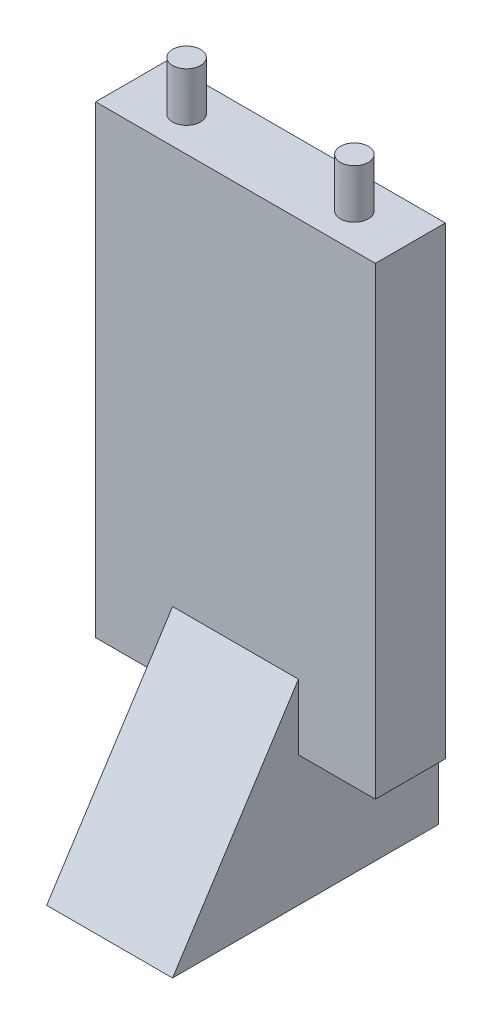
ISO-10303-21;
HEADER;
FILE_DESCRIPTION(('STEP AP214'),'2;1');
FILE_NAME('part.step','',(''),(''),'','','');
FILE_SCHEMA(('AUTOMOTIVE_DESIGN { 1 0 10303 214 1 1 1 1 }'));
ENDSEC;
DATA;
#1=APPLICATION_CONTEXT('core data for automotive mechanical design processes');
#2=APPLICATION_PROTOCOL_DEFINITION('international standard','automotive_design',2000,#1);
#3=PRODUCT_CONTEXT('',#1,'mechanical');
#4=PRODUCT('Part','Part','',(#3));
#5=PRODUCT_RELATED_PRODUCT_CATEGORY('part','',(#4));
#6=PRODUCT_DEFINITION_FORMATION('','',#4);
#7=PRODUCT_DEFINITION_CONTEXT('part definition',#1,'design');
#8=PRODUCT_DEFINITION('design','',#6,#7);
#9=PRODUCT_DEFINITION_SHAPE('','',#8);
#10=(LENGTH_UNIT() NAMED_UNIT(*) SI_UNIT(.MILLI.,.METRE.));
#11=(NAMED_UNIT(*) PLANE_ANGLE_UNIT() SI_UNIT($,.RADIAN.));
#12=(NAMED_UNIT(*) SI_UNIT($,.STERADIAN.) SOLID_ANGLE_UNIT());
#13=UNCERTAINTY_MEASURE_WITH_UNIT(LENGTH_MEASURE(1.E-05),#10,'distance_accuracy_value','');
#14=(GEOMETRIC_REPRESENTATION_CONTEXT(3) GLOBAL_UNCERTAINTY_ASSIGNED_CONTEXT((#13)) GLOBAL_UNIT_ASSIGNED_CONTEXT((#10,
#11,#12)) REPRESENTATION_CONTEXT('',''));
#15=CARTESIAN_POINT('',(0.,0.,0.));
#16=DIRECTION('',(0.,0.,1.));
#17=DIRECTION('',(1.,0.,0.));
#18=AXIS2_PLACEMENT_3D('',#15,#16,#17);
#19=CARTESIAN_POINT('',(-21.3420120940224,215.9,10.6710060470112));
#20=DIRECTION('',(0.,0.,-1.));
#21=DIRECTION('',(-1.,0.,0.));
#22=AXIS2_PLACEMENT_3D('',#19,#20,#21);
#23=PLANE('',#22);
#24=DIRECTION('',(0.,-1.,0.));
#25=VECTOR('',#24,1.);
#26=CARTESIAN_POINT('',(6.59798790597757,0.,10.6710060470112));
#27=LINE('',#26,#25);
#28=CARTESIAN_POINT('',(6.59798790597756,71.12,10.6710060470112));
#29=VERTEX_POINT('',#28);
#30=CARTESIAN_POINT('',(6.59798790597757,47.3460802250252,10.6710060470112));
#31=VERTEX_POINT('',#30);
#32=EDGE_CURVE('E186',#29,#31,#27,.T.);
#33=ORIENTED_EDGE('',*,*,#32,.F.);
#34=DIRECTION('',(-1.,0.,0.));
#35=VECTOR('',#34,1.);
#36=CARTESIAN_POINT('',(6.59798790597757,71.12,10.6710060470112));
#37=LINE('',#36,#35);
#38=CARTESIAN_POINT('',(52.3179879059776,71.12,10.6710060470112));
#39=VERTEX_POINT('',#38);
#40=EDGE_CURVE('E193',#39,#29,#37,.T.);
#41=ORIENTED_EDGE('',*,*,#40,.F.);
#42=DIRECTION('',(0.,1.,0.));
#43=VECTOR('',#42,1.);
#44=CARTESIAN_POINT('',(52.3179879059776,0.,10.6710060470112));
#45=LINE('',#44,#43);
#46=CARTESIAN_POINT('',(52.3179879059776,47.3460802250251,10.6710060470112));
#47=VERTEX_POINT('',#46);
#48=EDGE_CURVE('E56',#47,#39,#45,.T.);
#49=ORIENTED_EDGE('',*,*,#48,.F.);
#50=DIRECTION('',(-1.,0.,0.));
#51=VECTOR('',#50,1.);
#52=CARTESIAN_POINT('',(80.2579879059776,47.3460802250252,10.6710060470112));
#53=LINE('',#52,#51);
#54=CARTESIAN_POINT('',(80.2579879059776,47.3460802250252,10.6710060470112));
#55=VERTEX_POINT('',#54);
#56=EDGE_CURVE('E205',#55,#47,#53,.T.);
#57=ORIENTED_EDGE('',*,*,#56,.F.);
#58=DIRECTION('',(0.,-1.,0.));
#59=VECTOR('',#58,1.);
#60=CARTESIAN_POINT('',(80.2579879059776,215.9,10.6710060470112));
#61=LINE('',#60,#59);
#62=CARTESIAN_POINT('',(80.2579879059776,215.9,10.6710060470112));
#63=VERTEX_POINT('',#62);
#64=EDGE_CURVE('E245',#63,#55,#61,.T.);
#65=ORIENTED_EDGE('',*,*,#64,.F.);
#66=DIRECTION('',(1.,0.,0.));
#67=VECTOR('',#66,1.);
#68=CARTESIAN_POINT('',(-21.3420120940224,215.9,10.6710060470112));
#69=LINE('',#68,#67);
#70=CARTESIAN_POINT('',(-21.3420120940224,215.9,10.6710060470112));
#71=VERTEX_POINT('',#70);
#72=EDGE_CURVE('E238',#71,#63,#69,.T.);
#73=ORIENTED_EDGE('',*,*,#72,.F.);
#74=DIRECTION('',(0.,-1.,0.));
#75=VECTOR('',#74,1.);
#76=CARTESIAN_POINT('',(-21.3420120940224,215.9,10.6710060470112));
#77=LINE('',#76,#75);
#78=CARTESIAN_POINT('',(-21.3420120940224,47.3460802250252,10.6710060470112));
#79=VERTEX_POINT('',#78);
#80=EDGE_CURVE('E72',#71,#79,#77,.T.);
#81=ORIENTED_EDGE('',*,*,#80,.T.);
#82=DIRECTION('',(-1.,0.,0.));
#83=VECTOR('',#82,1.);
#84=CARTESIAN_POINT('',(-21.3420120940224,47.3460802250252,10.6710060470112));
#85=LINE('',#84,#83);
#86=EDGE_CURVE('E201',#31,#79,#85,.T.);
#87=ORIENTED_EDGE('',*,*,#86,.F.);
#88=EDGE_LOOP('',(#33,#41,#49,#57,#65,#73,#81,#87));
#89=FACE_BOUND('',#88,.T.);
#90=ADVANCED_FACE('F46',(#89),#23,.F.);
#91=CARTESIAN_POINT('',(-21.3420120940224,215.9,10.6710060470112));
#92=DIRECTION('',(-1.,0.,0.));
#93=DIRECTION('',(0.,0.,1.));
#94=AXIS2_PLACEMENT_3D('',#91,#92,#93);
#95=PLANE('',#94);
#96=DIRECTION('',(0.,0.,1.));
#97=VECTOR('',#96,1.);
#98=CARTESIAN_POINT('',(-21.3420120940224,47.3460802250252,-17.0149939529888));
#99=LINE('',#98,#97);
#100=CARTESIAN_POINT('',(-21.3420120940224,47.3460802250252,-14.7289939529888));
#101=VERTEX_POINT('',#100);
#102=EDGE_CURVE('E206',#101,#79,#99,.T.);
#103=ORIENTED_EDGE('',*,*,#102,.T.);
#104=ORIENTED_EDGE('',*,*,#80,.F.);
#105=DIRECTION('',(0.,0.,-1.));
#106=VECTOR('',#105,1.);
#107=CARTESIAN_POINT('',(-21.3420120940224,215.9,10.6710060470112));
#108=LINE('',#107,#106);
#109=CARTESIAN_POINT('',(-21.3420120940224,215.9,-14.7289939529888));
#110=VERTEX_POINT('',#109);
#111=EDGE_CURVE('E225',#71,#110,#108,.T.);
#112=ORIENTED_EDGE('',*,*,#111,.T.);
#113=DIRECTION('',(0.,-1.,0.));
#114=VECTOR('',#113,1.);
#115=CARTESIAN_POINT('',(-21.3420120940224,215.9,-14.7289939529888));
#116=LINE('',#115,#114);
#117=EDGE_CURVE('E241',#110,#101,#116,.T.);
#118=ORIENTED_EDGE('',*,*,#117,.T.);
#119=EDGE_LOOP('',(#103,#104,#112,#118));
#120=FACE_BOUND('',#119,.T.);
#121=ADVANCED_FACE('F48',(#120),#95,.T.);
#122=CARTESIAN_POINT('',(80.2579879059776,215.9,10.6710060470112));
#123=DIRECTION('',(-1.,0.,0.));
#124=DIRECTION('',(0.,0.,1.));
#125=AXIS2_PLACEMENT_3D('',#122,#123,#124);
#126=PLANE('',#125);
#127=ORIENTED_EDGE('',*,*,#64,.T.);
#128=DIRECTION('',(0.,0.,1.));
#129=VECTOR('',#128,1.);
#130=CARTESIAN_POINT('',(80.2579879059776,47.3460802250252,-17.0149939529888));
#131=LINE('',#130,#129);
#132=CARTESIAN_POINT('',(80.2579879059776,47.3460802250252,-14.7289939529888));
#133=VERTEX_POINT('',#132);
#134=EDGE_CURVE('E212',#133,#55,#131,.T.);
#135=ORIENTED_EDGE('',*,*,#134,.F.);
#136=DIRECTION('',(0.,-1.,0.));
#137=VECTOR('',#136,1.);
#138=CARTESIAN_POINT('',(80.2579879059776,215.9,-14.7289939529888));
#139=LINE('',#138,#137);
#140=CARTESIAN_POINT('',(80.2579879059776,215.9,-14.7289939529888));
#141=VERTEX_POINT('',#140);
#142=EDGE_CURVE('E249',#141,#133,#139,.T.);
#143=ORIENTED_EDGE('',*,*,#142,.F.);
#144=DIRECTION('',(0.,0.,-1.));
#145=VECTOR('',#144,1.);
#146=CARTESIAN_POINT('',(80.2579879059776,215.9,10.6710060470112));
#147=LINE('',#146,#145);
#148=EDGE_CURVE('E235',#63,#141,#147,.T.);
#149=ORIENTED_EDGE('',*,*,#148,.F.);
#150=EDGE_LOOP('',(#127,#135,#143,#149));
#151=FACE_BOUND('',#150,.T.);
#152=ADVANCED_FACE('F289',(#151),#126,.F.);
#153=CARTESIAN_POINT('',(-21.3420120940224,215.9,-14.7289939529888));
#154=DIRECTION('',(0.,0.,-1.));
#155=DIRECTION('',(-1.,0.,0.));
#156=AXIS2_PLACEMENT_3D('',#153,#154,#155);
#157=PLANE('',#156);
#158=DIRECTION('',(0.,-1.,0.));
#159=VECTOR('',#158,1.);
#160=CARTESIAN_POINT('',(52.3179879059776,47.3460802250251,-14.7289939529888));
#161=LINE('',#160,#159);
#162=CARTESIAN_POINT('',(52.3179879059776,70.9793744220683,-14.7289939529888));
#163=VERTEX_POINT('',#162);
#164=CARTESIAN_POINT('',(52.3179879059776,47.3460802250251,-14.7289939529888));
#165=VERTEX_POINT('',#164);
#166=EDGE_CURVE('E64',#163,#165,#161,.T.);
#167=ORIENTED_EDGE('',*,*,#166,.F.);
#168=DIRECTION('',(1.,0.,0.));
#169=VECTOR('',#168,1.);
#170=CARTESIAN_POINT('',(6.59798790597757,70.9793744220683,-14.7289939529888));
#171=LINE('',#170,#169);
#172=CARTESIAN_POINT('',(6.59798790597757,70.9793744220683,-14.7289939529888));
#173=VERTEX_POINT('',#172);
#174=EDGE_CURVE('E166',#173,#163,#171,.T.);
#175=ORIENTED_EDGE('',*,*,#174,.F.);
#176=DIRECTION('',(0.,1.,0.));
#177=VECTOR('',#176,1.);
#178=CARTESIAN_POINT('',(6.59798790597757,47.3460802250252,-14.7289939529888));
#179=LINE('',#178,#177);
#180=CARTESIAN_POINT('',(6.59798790597757,47.3460802250252,-14.7289939529888));
#181=VERTEX_POINT('',#180);
#182=EDGE_CURVE('E12',#181,#173,#179,.T.);
#183=ORIENTED_EDGE('',*,*,#182,.F.);
#184=DIRECTION('',(1.,0.,0.));
#185=VECTOR('',#184,1.);
#186=CARTESIAN_POINT('',(-21.3420120940224,47.3460802250251,-14.7289939529888));
#187=LINE('',#186,#185);
#188=EDGE_CURVE('E50',#101,#181,#187,.T.);
#189=ORIENTED_EDGE('',*,*,#188,.F.);
#190=ORIENTED_EDGE('',*,*,#117,.F.);
#191=DIRECTION('',(1.,0.,0.));
#192=VECTOR('',#191,1.);
#193=CARTESIAN_POINT('',(-21.3420120940224,215.9,-14.7289939529888));
#194=LINE('',#193,#192);
#195=EDGE_CURVE('E231',#110,#141,#194,.T.);
#196=ORIENTED_EDGE('',*,*,#195,.T.);
#197=ORIENTED_EDGE('',*,*,#142,.T.);
#198=DIRECTION('',(1.,0.,0.));
#199=VECTOR('',#198,1.);
#200=CARTESIAN_POINT('',(-21.3420120940224,47.3460802250251,-14.7289939529888));
#201=LINE('',#200,#199);
#202=EDGE_CURVE('E263',#165,#133,#201,.T.);
#203=ORIENTED_EDGE('',*,*,#202,.F.);
#204=EDGE_LOOP('',(#167,#175,#183,#189,#190,#196,#197,#203));
#205=FACE_BOUND('',#204,.T.);
#206=ADVANCED_FACE('F282',(#205),#157,.T.);
#207=CARTESIAN_POINT('',(0.,215.9,0.));
#208=DIRECTION('',(0.,-1.,0.));
#209=DIRECTION('',(0.,0.,-1.));
#210=AXIS2_PLACEMENT_3D('',#207,#208,#209);
#211=PLANE('',#210);
#212=CARTESIAN_POINT('',(59.9379879059776,215.9,-2.02899395298878));
#213=DIRECTION('',(0.,-1.,0.));
#214=DIRECTION('',(0.,0.,-1.));
#215=AXIS2_PLACEMENT_3D('',#212,#213,#214);
#216=CIRCLE('',#215,5.08);
#217=CARTESIAN_POINT('',(59.9379879059776,215.9,-7.10899395298879));
#218=VERTEX_POINT('',#217);
#219=EDGE_CURVE('E148',#218,#218,#216,.F.);
#220=ORIENTED_EDGE('',*,*,#219,.F.);
#221=EDGE_LOOP('',(#220));
#222=FACE_BOUND('',#221,.T.);
#223=CARTESIAN_POINT('',(-1.02201209402243,215.9,-2.02899395298878));
#224=DIRECTION('',(0.,-1.,0.));
#225=DIRECTION('',(0.,0.,-1.));
#226=AXIS2_PLACEMENT_3D('',#223,#224,#225);
#227=CIRCLE('',#226,5.08);
#228=CARTESIAN_POINT('',(-1.02201209402243,215.9,-7.10899395298878));
#229=VERTEX_POINT('',#228);
#230=EDGE_CURVE('E244',#229,#229,#227,.F.);
#231=ORIENTED_EDGE('',*,*,#230,.F.);
#232=EDGE_LOOP('',(#231));
#233=FACE_BOUND('',#232,.T.);
#234=ORIENTED_EDGE('',*,*,#111,.F.);
#235=ORIENTED_EDGE('',*,*,#72,.T.);
#236=ORIENTED_EDGE('',*,*,#148,.T.);
#237=ORIENTED_EDGE('',*,*,#195,.F.);
#238=EDGE_LOOP('',(#234,#235,#236,#237));
#239=FACE_BOUND('',#238,.T.);
#240=ADVANCED_FACE('F284',(#222,#233,#239),#211,.F.);
#241=CARTESIAN_POINT('',(0.,0.,0.));
#242=DIRECTION('',(0.,-1.,0.));
#243=DIRECTION('',(0.,0.,-1.));
#244=AXIS2_PLACEMENT_3D('',#241,#242,#243);
#245=PLANE('',#244);
#246=DIRECTION('',(0.,0.,1.));
#247=VECTOR('',#246,1.);
#248=CARTESIAN_POINT('',(6.59798790597757,0.,0.));
#249=LINE('',#248,#247);
#250=CARTESIAN_POINT('',(6.59798790597757,0.,-40.1289939529888));
#251=VERTEX_POINT('',#250);
#252=CARTESIAN_POINT('',(6.59798790597757,0.,56.3910060470112));
#253=VERTEX_POINT('',#252);
#254=EDGE_CURVE('E147',#251,#253,#249,.T.);
#255=ORIENTED_EDGE('',*,*,#254,.F.);
#256=DIRECTION('',(-1.,0.,0.));
#257=VECTOR('',#256,1.);
#258=CARTESIAN_POINT('',(52.3179879059776,0.,-40.1289939529888));
#259=LINE('',#258,#257);
#260=CARTESIAN_POINT('',(52.3179879059776,0.,-40.1289939529888));
#261=VERTEX_POINT('',#260);
#262=EDGE_CURVE('E151',#261,#251,#259,.T.);
#263=ORIENTED_EDGE('',*,*,#262,.F.);
#264=DIRECTION('',(0.,0.,-1.));
#265=VECTOR('',#264,1.);
#266=CARTESIAN_POINT('',(52.3179879059776,0.,0.));
#267=LINE('',#266,#265);
#268=CARTESIAN_POINT('',(52.3179879059776,0.,56.3910060470112));
#269=VERTEX_POINT('',#268);
#270=EDGE_CURVE('E135',#269,#261,#267,.T.);
#271=ORIENTED_EDGE('',*,*,#270,.F.);
#272=DIRECTION('',(1.,0.,0.));
#273=VECTOR('',#272,1.);
#274=CARTESIAN_POINT('',(6.59798790597757,0.,56.3910060470112));
#275=LINE('',#274,#273);
#276=EDGE_CURVE('E189',#253,#269,#275,.T.);
#277=ORIENTED_EDGE('',*,*,#276,.F.);
#278=EDGE_LOOP('',(#255,#263,#271,#277));
#279=FACE_BOUND('',#278,.T.);
#280=ADVANCED_FACE('F152',(#279),#245,.T.);
#281=CARTESIAN_POINT('',(-1.02201209402243,233.68,-2.02899395298878));
#282=DIRECTION('',(0.,-1.,0.));
#283=DIRECTION('',(0.,0.,-1.));
#284=AXIS2_PLACEMENT_3D('',#281,#282,#283);
#285=CYLINDRICAL_SURFACE('',#284,5.08);
#286=CARTESIAN_POINT('',(-1.02201209402243,233.68,-2.02899395298878));
#287=DIRECTION('',(0.,1.,0.));
#288=DIRECTION('',(0.,0.,1.));
#289=AXIS2_PLACEMENT_3D('',#286,#287,#288);
#290=CIRCLE('',#289,5.08);
#291=CARTESIAN_POINT('',(-1.02201209402243,233.68,3.05100604701122));
#292=VERTEX_POINT('',#291);
#293=EDGE_CURVE('E209',#292,#292,#290,.T.);
#294=ORIENTED_EDGE('',*,*,#293,.F.);
#295=EDGE_LOOP('',(#294));
#296=FACE_BOUND('',#295,.T.);
#297=ORIENTED_EDGE('',*,*,#230,.T.);
#298=EDGE_LOOP('',(#297));
#299=FACE_BOUND('',#298,.T.);
#300=ADVANCED_FACE('F321',(#296,#299),#285,.T.);
#301=CARTESIAN_POINT('',(-1.02201209402243,233.68,-2.02899395298878));
#302=DIRECTION('',(0.,1.,0.));
#303=DIRECTION('',(0.,0.,1.));
#304=AXIS2_PLACEMENT_3D('',#301,#302,#303);
#305=PLANE('',#304);
#306=ORIENTED_EDGE('',*,*,#293,.T.);
#307=EDGE_LOOP('',(#306));
#308=FACE_BOUND('',#307,.T.);
#309=ADVANCED_FACE('F325',(#308),#305,.T.);
#310=CARTESIAN_POINT('',(59.9379879059776,233.68,-2.02899395298878));
#311=DIRECTION('',(0.,-1.,0.));
#312=DIRECTION('',(0.,0.,-1.));
#313=AXIS2_PLACEMENT_3D('',#310,#311,#312);
#314=CYLINDRICAL_SURFACE('',#313,5.08);
#315=CARTESIAN_POINT('',(59.9379879059776,233.68,-2.02899395298878));
#316=DIRECTION('',(0.,1.,0.));
#317=DIRECTION('',(0.,0.,1.));
#318=AXIS2_PLACEMENT_3D('',#315,#316,#317);
#319=CIRCLE('',#318,5.08);
#320=CARTESIAN_POINT('',(59.9379879059776,233.68,3.05100604701122));
#321=VERTEX_POINT('',#320);
#322=EDGE_CURVE('E221',#321,#321,#319,.T.);
#323=ORIENTED_EDGE('',*,*,#322,.F.);
#324=EDGE_LOOP('',(#323));
#325=FACE_BOUND('',#324,.T.);
#326=ORIENTED_EDGE('',*,*,#219,.T.);
#327=EDGE_LOOP('',(#326));
#328=FACE_BOUND('',#327,.T.);
#329=ADVANCED_FACE('F328',(#325,#328),#314,.T.);
#330=CARTESIAN_POINT('',(59.9379879059776,233.68,-2.02899395298878));
#331=DIRECTION('',(0.,1.,0.));
#332=DIRECTION('',(0.,0.,1.));
#333=AXIS2_PLACEMENT_3D('',#330,#331,#332);
#334=PLANE('',#333);
#335=ORIENTED_EDGE('',*,*,#322,.T.);
#336=EDGE_LOOP('',(#335));
#337=FACE_BOUND('',#336,.T.);
#338=ADVANCED_FACE('F334',(#337),#334,.T.);
#339=CARTESIAN_POINT('',(52.3179879059776,0.,-17.0149939529888));
#340=DIRECTION('',(-1.,0.,0.));
#341=DIRECTION('',(0.,0.,1.));
#342=AXIS2_PLACEMENT_3D('',#339,#340,#341);
#343=PLANE('',#342);
#344=ORIENTED_EDGE('',*,*,#48,.T.);
#345=DIRECTION('',(0.,0.841178475376553,-0.540757591313499));
#346=VECTOR('',#345,1.);
#347=CARTESIAN_POINT('',(52.3179879059776,71.12,10.6710060470112));
#348=LINE('',#347,#346);
#349=EDGE_CURVE('E143',#269,#39,#348,.T.);
#350=ORIENTED_EDGE('',*,*,#349,.F.);
#351=ORIENTED_EDGE('',*,*,#270,.T.);
#352=DIRECTION('',(0.,-1.,0.));
#353=VECTOR('',#352,1.);
#354=CARTESIAN_POINT('',(52.3179879059776,47.3460802250251,-40.1289939529888));
#355=LINE('',#354,#353);
#356=CARTESIAN_POINT('',(52.3179879059776,70.9793744220683,-40.1289939529888));
#357=VERTEX_POINT('',#356);
#358=EDGE_CURVE('E141',#357,#261,#355,.T.);
#359=ORIENTED_EDGE('',*,*,#358,.F.);
#360=DIRECTION('',(0.,0.,1.));
#361=VECTOR('',#360,1.);
#362=CARTESIAN_POINT('',(52.3179879059776,70.9793744220683,-40.1289939529888));
#363=LINE('',#362,#361);
#364=EDGE_CURVE('E172',#357,#163,#363,.T.);
#365=ORIENTED_EDGE('',*,*,#364,.T.);
#366=ORIENTED_EDGE('',*,*,#166,.T.);
#367=DIRECTION('',(0.,0.,1.));
#368=VECTOR('',#367,1.);
#369=CARTESIAN_POINT('',(52.3179879059776,47.3460802250251,-17.0149939529888));
#370=LINE('',#369,#368);
#371=EDGE_CURVE('E192',#165,#47,#370,.T.);
#372=ORIENTED_EDGE('',*,*,#371,.T.);
#373=EDGE_LOOP('',(#344,#350,#351,#359,#365,#366,#372));
#374=FACE_BOUND('',#373,.T.);
#375=ADVANCED_FACE('F138',(#374),#343,.F.);
#376=CARTESIAN_POINT('',(80.2579879059776,47.3460802250252,-17.0149939529888));
#377=DIRECTION('',(0.,1.,0.));
#378=DIRECTION('',(-1.,0.,0.));
#379=AXIS2_PLACEMENT_3D('',#376,#377,#378);
#380=PLANE('',#379);
#381=ORIENTED_EDGE('',*,*,#202,.T.);
#382=ORIENTED_EDGE('',*,*,#134,.T.);
#383=ORIENTED_EDGE('',*,*,#56,.T.);
#384=ORIENTED_EDGE('',*,*,#371,.F.);
#385=EDGE_LOOP('',(#381,#382,#383,#384));
#386=FACE_BOUND('',#385,.T.);
#387=ADVANCED_FACE('F341',(#386),#380,.F.);
#388=CARTESIAN_POINT('',(-21.3420120940224,47.3460802250252,-17.0149939529888));
#389=DIRECTION('',(0.,1.,0.));
#390=DIRECTION('',(0.,0.,1.));
#391=AXIS2_PLACEMENT_3D('',#388,#389,#390);
#392=PLANE('',#391);
#393=ORIENTED_EDGE('',*,*,#188,.T.);
#394=DIRECTION('',(0.,0.,1.));
#395=VECTOR('',#394,1.);
#396=CARTESIAN_POINT('',(6.59798790597757,47.3460802250252,-17.0149939529888));
#397=LINE('',#396,#395);
#398=EDGE_CURVE('E204',#181,#31,#397,.T.);
#399=ORIENTED_EDGE('',*,*,#398,.T.);
#400=ORIENTED_EDGE('',*,*,#86,.T.);
#401=ORIENTED_EDGE('',*,*,#102,.F.);
#402=EDGE_LOOP('',(#393,#399,#400,#401));
#403=FACE_BOUND('',#402,.T.);
#404=ADVANCED_FACE('F272',(#403),#392,.F.);
#405=CARTESIAN_POINT('',(6.59798790597757,0.,-17.0149939529888));
#406=DIRECTION('',(1.,0.,0.));
#407=DIRECTION('',(0.,0.,-1.));
#408=AXIS2_PLACEMENT_3D('',#405,#406,#407);
#409=PLANE('',#408);
#410=ORIENTED_EDGE('',*,*,#254,.T.);
#411=DIRECTION('',(0.,0.841178475376553,-0.540757591313499));
#412=VECTOR('',#411,1.);
#413=CARTESIAN_POINT('',(6.59798790597756,71.12,10.6710060470112));
#414=LINE('',#413,#412);
#415=EDGE_CURVE('E182',#253,#29,#414,.T.);
#416=ORIENTED_EDGE('',*,*,#415,.T.);
#417=ORIENTED_EDGE('',*,*,#32,.T.);
#418=ORIENTED_EDGE('',*,*,#398,.F.);
#419=ORIENTED_EDGE('',*,*,#182,.T.);
#420=DIRECTION('',(0.,0.,1.));
#421=VECTOR('',#420,1.);
#422=CARTESIAN_POINT('',(6.59798790597757,70.9793744220683,-40.1289939529888));
#423=LINE('',#422,#421);
#424=CARTESIAN_POINT('',(6.59798790597757,70.9793744220683,-40.1289939529888));
#425=VERTEX_POINT('',#424);
#426=EDGE_CURVE('E178',#425,#173,#423,.T.);
#427=ORIENTED_EDGE('',*,*,#426,.F.);
#428=DIRECTION('',(0.,1.,0.));
#429=VECTOR('',#428,1.);
#430=CARTESIAN_POINT('',(6.59798790597757,0.,-40.1289939529888));
#431=LINE('',#430,#429);
#432=EDGE_CURVE('E157',#251,#425,#431,.T.);
#433=ORIENTED_EDGE('',*,*,#432,.F.);
#434=EDGE_LOOP('',(#410,#416,#417,#418,#419,#427,#433));
#435=FACE_BOUND('',#434,.T.);
#436=ADVANCED_FACE('F275',(#435),#409,.F.);
#437=CARTESIAN_POINT('',(6.59798790597756,71.12,10.6710060470112));
#438=DIRECTION('',(0.,-0.540757591313499,-0.841178475376553));
#439=DIRECTION('',(0.,0.841178475376554,-0.540757591313499));
#440=AXIS2_PLACEMENT_3D('',#437,#438,#439);
#441=PLANE('',#440);
#442=ORIENTED_EDGE('',*,*,#349,.T.);
#443=ORIENTED_EDGE('',*,*,#40,.T.);
#444=ORIENTED_EDGE('',*,*,#415,.F.);
#445=ORIENTED_EDGE('',*,*,#276,.T.);
#446=EDGE_LOOP('',(#442,#443,#444,#445));
#447=FACE_BOUND('',#446,.T.);
#448=ADVANCED_FACE('F293',(#447),#441,.F.);
#449=CARTESIAN_POINT('',(6.59798790597757,70.9793744220683,-40.1289939529888));
#450=DIRECTION('',(0.,-1.,0.));
#451=DIRECTION('',(0.,0.,-1.));
#452=AXIS2_PLACEMENT_3D('',#449,#450,#451);
#453=PLANE('',#452);
#454=ORIENTED_EDGE('',*,*,#174,.T.);
#455=ORIENTED_EDGE('',*,*,#364,.F.);
#456=DIRECTION('',(1.,0.,0.));
#457=VECTOR('',#456,1.);
#458=CARTESIAN_POINT('',(6.59798790597757,70.9793744220683,-40.1289939529888));
#459=LINE('',#458,#457);
#460=EDGE_CURVE('E161',#425,#357,#459,.T.);
#461=ORIENTED_EDGE('',*,*,#460,.F.);
#462=ORIENTED_EDGE('',*,*,#426,.T.);
#463=EDGE_LOOP('',(#454,#455,#461,#462));
#464=FACE_BOUND('',#463,.T.);
#465=ADVANCED_FACE('F291',(#464),#453,.F.);
#466=CARTESIAN_POINT('',(0.,0.,-40.1289939529888));
#467=DIRECTION('',(0.,0.,-1.));
#468=DIRECTION('',(-1.,0.,0.));
#469=AXIS2_PLACEMENT_3D('',#466,#467,#468);
#470=PLANE('',#469);
#471=ORIENTED_EDGE('',*,*,#358,.T.);
#472=ORIENTED_EDGE('',*,*,#262,.T.);
#473=ORIENTED_EDGE('',*,*,#432,.T.);
#474=ORIENTED_EDGE('',*,*,#460,.T.);
#475=EDGE_LOOP('',(#471,#472,#473,#474));
#476=FACE_BOUND('',#475,.T.);
#477=ADVANCED_FACE('F159',(#476),#470,.T.);
#478=CLOSED_SHELL('',(#90,#121,#152,#206,#240,#280,#300,#309,#329,#338,#375,#387,#404,#436,#448,
#465,#477));
#479=MANIFOLD_SOLID_BREP('B2',#478);
#480=ADVANCED_BREP_SHAPE_REPRESENTATION('',(#18,#479),#14);
#481=SHAPE_DEFINITION_REPRESENTATION(#9,#480);
ENDSEC;
END-ISO-10303-21;
